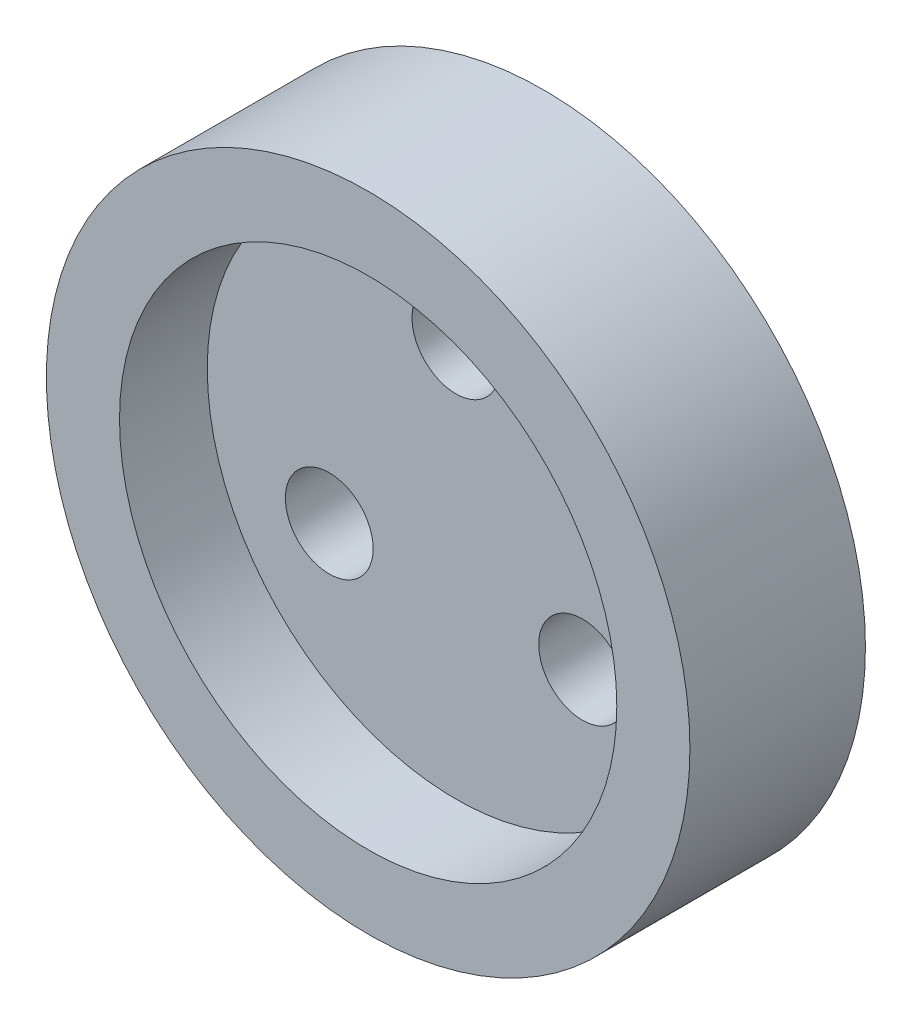
ISO-10303-21;
HEADER;
FILE_DESCRIPTION(('STEP AP214'),'2;1');
FILE_NAME('part.step','',(''),(''),'','','');
FILE_SCHEMA(('AUTOMOTIVE_DESIGN { 1 0 10303 214 1 1 1 1 }'));
ENDSEC;
DATA;
#1=APPLICATION_CONTEXT('core data for automotive mechanical design processes');
#2=APPLICATION_PROTOCOL_DEFINITION('international standard','automotive_design',2000,#1);
#3=PRODUCT_CONTEXT('',#1,'mechanical');
#4=PRODUCT('Part','Part','',(#3));
#5=PRODUCT_RELATED_PRODUCT_CATEGORY('part','',(#4));
#6=PRODUCT_DEFINITION_FORMATION('','',#4);
#7=PRODUCT_DEFINITION_CONTEXT('part definition',#1,'design');
#8=PRODUCT_DEFINITION('design','',#6,#7);
#9=PRODUCT_DEFINITION_SHAPE('','',#8);
#10=(LENGTH_UNIT() NAMED_UNIT(*) SI_UNIT(.MILLI.,.METRE.));
#11=(NAMED_UNIT(*) PLANE_ANGLE_UNIT() SI_UNIT($,.RADIAN.));
#12=(NAMED_UNIT(*) SI_UNIT($,.STERADIAN.) SOLID_ANGLE_UNIT());
#13=UNCERTAINTY_MEASURE_WITH_UNIT(LENGTH_MEASURE(1.E-05),#10,'distance_accuracy_value','');
#14=(GEOMETRIC_REPRESENTATION_CONTEXT(3) GLOBAL_UNCERTAINTY_ASSIGNED_CONTEXT((#13)) GLOBAL_UNIT_ASSIGNED_CONTEXT((#10,
#11,#12)) REPRESENTATION_CONTEXT('',''));
#15=CARTESIAN_POINT('',(0.,0.,0.));
#16=DIRECTION('',(0.,0.,1.));
#17=DIRECTION('',(1.,0.,0.));
#18=AXIS2_PLACEMENT_3D('',#15,#16,#17);
#19=CARTESIAN_POINT('',(0.,0.,3.));
#20=DIRECTION('',(0.,0.,1.));
#21=DIRECTION('',(1.,0.,0.));
#22=AXIS2_PLACEMENT_3D('',#19,#20,#21);
#23=PLANE('',#22);
#24=CARTESIAN_POINT('',(-4.33012701892219,-2.5,3.));
#25=DIRECTION('',(0.,0.,1.));
#26=DIRECTION('',(1.,0.,0.));
#27=AXIS2_PLACEMENT_3D('',#24,#25,#26);
#28=CIRCLE('',#27,1.5);
#29=CARTESIAN_POINT('',(-2.83012701892219,-2.5,3.));
#30=VERTEX_POINT('',#29);
#31=EDGE_CURVE('E60',#30,#30,#28,.T.);
#32=ORIENTED_EDGE('',*,*,#31,.F.);
#33=EDGE_LOOP('',(#32));
#34=FACE_BOUND('',#33,.T.);
#35=CARTESIAN_POINT('',(0.,5.,3.));
#36=DIRECTION('',(0.,0.,1.));
#37=DIRECTION('',(1.,0.,0.));
#38=AXIS2_PLACEMENT_3D('',#35,#36,#37);
#39=CIRCLE('',#38,1.5);
#40=CARTESIAN_POINT('',(1.5,5.,3.));
#41=VERTEX_POINT('',#40);
#42=EDGE_CURVE('E47',#41,#41,#39,.T.);
#43=ORIENTED_EDGE('',*,*,#42,.F.);
#44=EDGE_LOOP('',(#43));
#45=FACE_BOUND('',#44,.T.);
#46=CARTESIAN_POINT('',(4.33012701892219,-2.5,3.));
#47=DIRECTION('',(0.,0.,1.));
#48=DIRECTION('',(1.,0.,0.));
#49=AXIS2_PLACEMENT_3D('',#46,#47,#48);
#50=CIRCLE('',#49,1.5);
#51=CARTESIAN_POINT('',(5.83012701892219,-2.5,3.));
#52=VERTEX_POINT('',#51);
#53=EDGE_CURVE('E55',#52,#52,#50,.T.);
#54=ORIENTED_EDGE('',*,*,#53,.F.);
#55=EDGE_LOOP('',(#54));
#56=FACE_BOUND('',#55,.T.);
#57=CARTESIAN_POINT('',(0.,0.,3.));
#58=DIRECTION('',(0.,0.,1.));
#59=DIRECTION('',(1.,0.,0.));
#60=AXIS2_PLACEMENT_3D('',#57,#58,#59);
#61=CIRCLE('',#60,8.5);
#62=CARTESIAN_POINT('',(8.5,0.,3.));
#63=VERTEX_POINT('',#62);
#64=EDGE_CURVE('E10',#63,#63,#61,.F.);
#65=ORIENTED_EDGE('',*,*,#64,.F.);
#66=EDGE_LOOP('',(#65));
#67=FACE_BOUND('',#66,.T.);
#68=ADVANCED_FACE('F36',(#34,#45,#56,#67),#23,.T.);
#69=CARTESIAN_POINT('',(0.,0.,0.));
#70=DIRECTION('',(0.,0.,1.));
#71=DIRECTION('',(1.,0.,0.));
#72=AXIS2_PLACEMENT_3D('',#69,#70,#71);
#73=PLANE('',#72);
#74=CARTESIAN_POINT('',(0.,0.,0.));
#75=DIRECTION('',(0.,0.,1.));
#76=DIRECTION('',(1.,0.,0.));
#77=AXIS2_PLACEMENT_3D('',#74,#75,#76);
#78=CIRCLE('',#77,11.);
#79=CARTESIAN_POINT('',(11.,0.,0.));
#80=VERTEX_POINT('',#79);
#81=EDGE_CURVE('E43',#80,#80,#78,.T.);
#82=ORIENTED_EDGE('',*,*,#81,.F.);
#83=EDGE_LOOP('',(#82));
#84=FACE_BOUND('',#83,.T.);
#85=CARTESIAN_POINT('',(0.,5.,0.));
#86=DIRECTION('',(0.,0.,1.));
#87=DIRECTION('',(1.,0.,0.));
#88=AXIS2_PLACEMENT_3D('',#85,#86,#87);
#89=CIRCLE('',#88,1.5);
#90=CARTESIAN_POINT('',(1.5,5.,0.));
#91=VERTEX_POINT('',#90);
#92=EDGE_CURVE('E51',#91,#91,#89,.T.);
#93=ORIENTED_EDGE('',*,*,#92,.T.);
#94=EDGE_LOOP('',(#93));
#95=FACE_BOUND('',#94,.T.);
#96=CARTESIAN_POINT('',(4.33012701892219,-2.5,0.));
#97=DIRECTION('',(0.,0.,1.));
#98=DIRECTION('',(1.,0.,0.));
#99=AXIS2_PLACEMENT_3D('',#96,#97,#98);
#100=CIRCLE('',#99,1.5);
#101=CARTESIAN_POINT('',(5.83012701892219,-2.5,0.));
#102=VERTEX_POINT('',#101);
#103=EDGE_CURVE('E57',#102,#102,#100,.T.);
#104=ORIENTED_EDGE('',*,*,#103,.T.);
#105=EDGE_LOOP('',(#104));
#106=FACE_BOUND('',#105,.T.);
#107=CARTESIAN_POINT('',(-4.33012701892219,-2.5,0.));
#108=DIRECTION('',(0.,0.,1.));
#109=DIRECTION('',(1.,0.,0.));
#110=AXIS2_PLACEMENT_3D('',#107,#108,#109);
#111=CIRCLE('',#110,1.5);
#112=CARTESIAN_POINT('',(-2.83012701892219,-2.5,0.));
#113=VERTEX_POINT('',#112);
#114=EDGE_CURVE('E63',#113,#113,#111,.T.);
#115=ORIENTED_EDGE('',*,*,#114,.T.);
#116=EDGE_LOOP('',(#115));
#117=FACE_BOUND('',#116,.T.);
#118=ADVANCED_FACE('F91',(#84,#95,#106,#117),#73,.F.);
#119=CARTESIAN_POINT('',(0.,0.,3.));
#120=DIRECTION('',(0.,0.,-1.));
#121=DIRECTION('',(-1.,0.,0.));
#122=AXIS2_PLACEMENT_3D('',#119,#120,#121);
#123=CYLINDRICAL_SURFACE('',#122,11.);
#124=ORIENTED_EDGE('',*,*,#81,.T.);
#125=EDGE_LOOP('',(#124));
#126=FACE_BOUND('',#125,.T.);
#127=CARTESIAN_POINT('',(0.,0.,6.));
#128=DIRECTION('',(0.,0.,1.));
#129=DIRECTION('',(1.,0.,0.));
#130=AXIS2_PLACEMENT_3D('',#127,#128,#129);
#131=CIRCLE('',#130,11.);
#132=CARTESIAN_POINT('',(11.,0.,6.));
#133=VERTEX_POINT('',#132);
#134=EDGE_CURVE('E66',#133,#133,#131,.T.);
#135=ORIENTED_EDGE('',*,*,#134,.F.);
#136=EDGE_LOOP('',(#135));
#137=FACE_BOUND('',#136,.T.);
#138=ADVANCED_FACE('F38',(#126,#137),#123,.T.);
#139=CARTESIAN_POINT('',(0.,5.,3.));
#140=DIRECTION('',(0.,0.,-1.));
#141=DIRECTION('',(-1.,0.,0.));
#142=AXIS2_PLACEMENT_3D('',#139,#140,#141);
#143=CYLINDRICAL_SURFACE('',#142,1.5);
#144=ORIENTED_EDGE('',*,*,#42,.T.);
#145=EDGE_LOOP('',(#144));
#146=FACE_BOUND('',#145,.T.);
#147=ORIENTED_EDGE('',*,*,#92,.F.);
#148=EDGE_LOOP('',(#147));
#149=FACE_BOUND('',#148,.T.);
#150=ADVANCED_FACE('F101',(#146,#149),#143,.F.);
#151=CARTESIAN_POINT('',(4.33012701892219,-2.5,3.));
#152=DIRECTION('',(0.,0.,-1.));
#153=DIRECTION('',(-1.,0.,0.));
#154=AXIS2_PLACEMENT_3D('',#151,#152,#153);
#155=CYLINDRICAL_SURFACE('',#154,1.5);
#156=ORIENTED_EDGE('',*,*,#53,.T.);
#157=EDGE_LOOP('',(#156));
#158=FACE_BOUND('',#157,.T.);
#159=ORIENTED_EDGE('',*,*,#103,.F.);
#160=EDGE_LOOP('',(#159));
#161=FACE_BOUND('',#160,.T.);
#162=ADVANCED_FACE('F87',(#158,#161),#155,.F.);
#163=CARTESIAN_POINT('',(-4.33012701892219,-2.5,3.));
#164=DIRECTION('',(0.,0.,-1.));
#165=DIRECTION('',(-1.,0.,0.));
#166=AXIS2_PLACEMENT_3D('',#163,#164,#165);
#167=CYLINDRICAL_SURFACE('',#166,1.5);
#168=ORIENTED_EDGE('',*,*,#31,.T.);
#169=EDGE_LOOP('',(#168));
#170=FACE_BOUND('',#169,.T.);
#171=ORIENTED_EDGE('',*,*,#114,.F.);
#172=EDGE_LOOP('',(#171));
#173=FACE_BOUND('',#172,.T.);
#174=ADVANCED_FACE('F79',(#170,#173),#167,.F.);
#175=CARTESIAN_POINT('',(0.,0.,6.));
#176=DIRECTION('',(0.,0.,1.));
#177=DIRECTION('',(1.,0.,0.));
#178=AXIS2_PLACEMENT_3D('',#175,#176,#177);
#179=PLANE('',#178);
#180=ORIENTED_EDGE('',*,*,#134,.T.);
#181=EDGE_LOOP('',(#180));
#182=FACE_BOUND('',#181,.T.);
#183=CARTESIAN_POINT('',(0.,0.,6.));
#184=DIRECTION('',(0.,0.,1.));
#185=DIRECTION('',(1.,0.,0.));
#186=AXIS2_PLACEMENT_3D('',#183,#184,#185);
#187=CIRCLE('',#186,8.5);
#188=CARTESIAN_POINT('',(8.5,0.,6.));
#189=VERTEX_POINT('',#188);
#190=EDGE_CURVE('E71',#189,#189,#187,.T.);
#191=ORIENTED_EDGE('',*,*,#190,.F.);
#192=EDGE_LOOP('',(#191));
#193=FACE_BOUND('',#192,.T.);
#194=ADVANCED_FACE('F77',(#182,#193),#179,.T.);
#195=CARTESIAN_POINT('',(0.,0.,6.));
#196=DIRECTION('',(0.,0.,-1.));
#197=DIRECTION('',(-1.,0.,0.));
#198=AXIS2_PLACEMENT_3D('',#195,#196,#197);
#199=CYLINDRICAL_SURFACE('',#198,8.5);
#200=ORIENTED_EDGE('',*,*,#190,.T.);
#201=EDGE_LOOP('',(#200));
#202=FACE_BOUND('',#201,.T.);
#203=ORIENTED_EDGE('',*,*,#64,.T.);
#204=EDGE_LOOP('',(#203));
#205=FACE_BOUND('',#204,.T.);
#206=ADVANCED_FACE('F75',(#202,#205),#199,.F.);
#207=CLOSED_SHELL('',(#68,#118,#138,#150,#162,#174,#194,#206));
#208=MANIFOLD_SOLID_BREP('B2',#207);
#209=ADVANCED_BREP_SHAPE_REPRESENTATION('',(#18,#208),#14);
#210=SHAPE_DEFINITION_REPRESENTATION(#9,#209);
ENDSEC;
END-ISO-10303-21;
